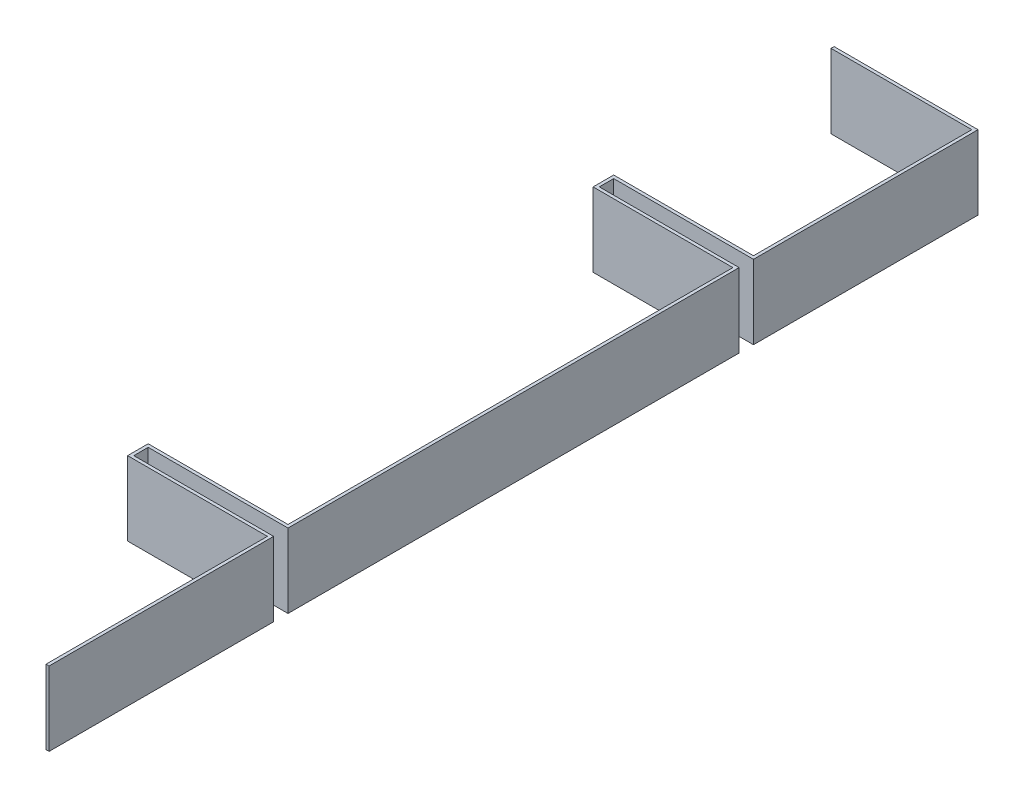
ISO-10303-21;
HEADER;
FILE_DESCRIPTION(('STEP AP214'),'2;1');
FILE_NAME('part.step','',(''),(''),'','','');
FILE_SCHEMA(('AUTOMOTIVE_DESIGN { 1 0 10303 214 1 1 1 1 }'));
ENDSEC;
DATA;
#1=APPLICATION_CONTEXT('core data for automotive mechanical design processes');
#2=APPLICATION_PROTOCOL_DEFINITION('international standard','automotive_design',2000,#1);
#3=PRODUCT_CONTEXT('',#1,'mechanical');
#4=PRODUCT('Part','Part','',(#3));
#5=PRODUCT_RELATED_PRODUCT_CATEGORY('part','',(#4));
#6=PRODUCT_DEFINITION_FORMATION('','',#4);
#7=PRODUCT_DEFINITION_CONTEXT('part definition',#1,'design');
#8=PRODUCT_DEFINITION('design','',#6,#7);
#9=PRODUCT_DEFINITION_SHAPE('','',#8);
#10=(LENGTH_UNIT() NAMED_UNIT(*) SI_UNIT(.MILLI.,.METRE.));
#11=(NAMED_UNIT(*) PLANE_ANGLE_UNIT() SI_UNIT($,.RADIAN.));
#12=(NAMED_UNIT(*) SI_UNIT($,.STERADIAN.) SOLID_ANGLE_UNIT());
#13=UNCERTAINTY_MEASURE_WITH_UNIT(LENGTH_MEASURE(1.E-05),#10,'distance_accuracy_value','');
#14=(GEOMETRIC_REPRESENTATION_CONTEXT(3) GLOBAL_UNCERTAINTY_ASSIGNED_CONTEXT((#13)) GLOBAL_UNIT_ASSIGNED_CONTEXT((#10,
#11,#12)) REPRESENTATION_CONTEXT('',''));
#15=CARTESIAN_POINT('',(0.,0.,0.));
#16=DIRECTION('',(0.,0.,1.));
#17=DIRECTION('',(1.,0.,0.));
#18=AXIS2_PLACEMENT_3D('',#15,#16,#17);
#19=CARTESIAN_POINT('',(-19.0500000000001,457.2,0.));
#20=DIRECTION('',(0.,0.,-1.));
#21=DIRECTION('',(-1.,0.,0.));
#22=AXIS2_PLACEMENT_3D('',#19,#20,#21);
#23=PLANE('',#22);
#24=DIRECTION('',(1.,0.,0.));
#25=VECTOR('',#24,1.);
#26=CARTESIAN_POINT('',(-19.0500000000001,0.,0.));
#27=LINE('',#26,#25);
#28=CARTESIAN_POINT('',(-19.0500000000001,0.,0.));
#29=VERTEX_POINT('',#28);
#30=CARTESIAN_POINT('',(0.,0.,0.));
#31=VERTEX_POINT('',#30);
#32=EDGE_CURVE('E226',#29,#31,#27,.T.);
#33=ORIENTED_EDGE('',*,*,#32,.T.);
#34=DIRECTION('',(0.,-1.,0.));
#35=VECTOR('',#34,1.);
#36=CARTESIAN_POINT('',(0.,457.2,0.));
#37=LINE('',#36,#35);
#38=CARTESIAN_POINT('',(0.,457.2,0.));
#39=VERTEX_POINT('',#38);
#40=EDGE_CURVE('E11',#39,#31,#37,.T.);
#41=ORIENTED_EDGE('',*,*,#40,.F.);
#42=DIRECTION('',(1.,0.,0.));
#43=VECTOR('',#42,1.);
#44=CARTESIAN_POINT('',(-19.0500000000001,457.2,0.));
#45=LINE('',#44,#43);
#46=CARTESIAN_POINT('',(-19.0500000000001,457.2,0.));
#47=VERTEX_POINT('',#46);
#48=EDGE_CURVE('E290',#47,#39,#45,.T.);
#49=ORIENTED_EDGE('',*,*,#48,.F.);
#50=DIRECTION('',(0.,-1.,0.));
#51=VECTOR('',#50,1.);
#52=CARTESIAN_POINT('',(-19.0500000000001,457.2,0.));
#53=LINE('',#52,#51);
#54=EDGE_CURVE('E222',#47,#29,#53,.T.);
#55=ORIENTED_EDGE('',*,*,#54,.T.);
#56=EDGE_LOOP('',(#33,#41,#49,#55));
#57=FACE_BOUND('',#56,.T.);
#58=ADVANCED_FACE('F41',(#57),#23,.F.);
#59=CARTESIAN_POINT('',(0.,457.2,0.));
#60=DIRECTION('',(-1.,0.,0.));
#61=DIRECTION('',(0.,0.,1.));
#62=AXIS2_PLACEMENT_3D('',#59,#60,#61);
#63=PLANE('',#62);
#64=DIRECTION('',(0.,0.,-1.));
#65=VECTOR('',#64,1.);
#66=CARTESIAN_POINT('',(0.,0.,0.));
#67=LINE('',#66,#65);
#68=CARTESIAN_POINT('',(0.,0.,-1386.84));
#69=VERTEX_POINT('',#68);
#70=EDGE_CURVE('E230',#31,#69,#67,.T.);
#71=ORIENTED_EDGE('',*,*,#70,.T.);
#72=DIRECTION('',(0.,-1.,0.));
#73=VECTOR('',#72,1.);
#74=CARTESIAN_POINT('',(0.,457.2,-1386.84));
#75=LINE('',#74,#73);
#76=CARTESIAN_POINT('',(0.,457.2,-1386.84));
#77=VERTEX_POINT('',#76);
#78=EDGE_CURVE('E50',#77,#69,#75,.T.);
#79=ORIENTED_EDGE('',*,*,#78,.F.);
#80=DIRECTION('',(0.,0.,-1.));
#81=VECTOR('',#80,1.);
#82=CARTESIAN_POINT('',(0.,457.2,0.));
#83=LINE('',#82,#81);
#84=EDGE_CURVE('E143',#39,#77,#83,.T.);
#85=ORIENTED_EDGE('',*,*,#84,.F.);
#86=ORIENTED_EDGE('',*,*,#40,.T.);
#87=EDGE_LOOP('',(#71,#79,#85,#86));
#88=FACE_BOUND('',#87,.T.);
#89=ADVANCED_FACE('F454',(#88),#63,.F.);
#90=CARTESIAN_POINT('',(0.,457.2,-1386.84));
#91=DIRECTION('',(0.,0.,1.));
#92=DIRECTION('',(1.,0.,0.));
#93=AXIS2_PLACEMENT_3D('',#90,#91,#92);
#94=PLANE('',#93);
#95=DIRECTION('',(-1.,0.,0.));
#96=VECTOR('',#95,1.);
#97=CARTESIAN_POINT('',(0.,0.,-1386.84));
#98=LINE('',#97,#96);
#99=CARTESIAN_POINT('',(-863.6,0.,-1386.84));
#100=VERTEX_POINT('',#99);
#101=EDGE_CURVE('E233',#69,#100,#98,.T.);
#102=ORIENTED_EDGE('',*,*,#101,.T.);
#103=DIRECTION('',(0.,-1.,0.));
#104=VECTOR('',#103,1.);
#105=CARTESIAN_POINT('',(-863.6,457.2,-1386.84));
#106=LINE('',#105,#104);
#107=CARTESIAN_POINT('',(-863.6,457.2,-1386.84));
#108=VERTEX_POINT('',#107);
#109=EDGE_CURVE('E357',#108,#100,#106,.T.);
#110=ORIENTED_EDGE('',*,*,#109,.F.);
#111=DIRECTION('',(-1.,0.,0.));
#112=VECTOR('',#111,1.);
#113=CARTESIAN_POINT('',(0.,457.2,-1386.84));
#114=LINE('',#113,#112);
#115=EDGE_CURVE('E367',#77,#108,#114,.T.);
#116=ORIENTED_EDGE('',*,*,#115,.F.);
#117=ORIENTED_EDGE('',*,*,#78,.T.);
#118=EDGE_LOOP('',(#102,#110,#116,#117));
#119=FACE_BOUND('',#118,.T.);
#120=ADVANCED_FACE('F365',(#119),#94,.F.);
#121=CARTESIAN_POINT('',(-863.6,457.2,-1386.84));
#122=DIRECTION('',(-1.,0.,0.));
#123=DIRECTION('',(0.,0.,1.));
#124=AXIS2_PLACEMENT_3D('',#121,#122,#123);
#125=PLANE('',#124);
#126=DIRECTION('',(0.,0.,-1.));
#127=VECTOR('',#126,1.);
#128=CARTESIAN_POINT('',(-863.6,0.,-1386.84));
#129=LINE('',#128,#127);
#130=CARTESIAN_POINT('',(-863.6,0.,-1475.74));
#131=VERTEX_POINT('',#130);
#132=EDGE_CURVE('E236',#100,#131,#129,.T.);
#133=ORIENTED_EDGE('',*,*,#132,.T.);
#134=DIRECTION('',(0.,-1.,0.));
#135=VECTOR('',#134,1.);
#136=CARTESIAN_POINT('',(-863.6,457.2,-1475.74));
#137=LINE('',#136,#135);
#138=CARTESIAN_POINT('',(-863.6,457.2,-1475.74));
#139=VERTEX_POINT('',#138);
#140=EDGE_CURVE('E353',#139,#131,#137,.T.);
#141=ORIENTED_EDGE('',*,*,#140,.F.);
#142=DIRECTION('',(0.,0.,-1.));
#143=VECTOR('',#142,1.);
#144=CARTESIAN_POINT('',(-863.6,457.2,-1386.84));
#145=LINE('',#144,#143);
#146=EDGE_CURVE('E386',#108,#139,#145,.T.);
#147=ORIENTED_EDGE('',*,*,#146,.F.);
#148=ORIENTED_EDGE('',*,*,#109,.T.);
#149=EDGE_LOOP('',(#133,#141,#147,#148));
#150=FACE_BOUND('',#149,.T.);
#151=ADVANCED_FACE('F376',(#150),#125,.F.);
#152=CARTESIAN_POINT('',(-863.6,457.2,-1475.74));
#153=DIRECTION('',(0.,0.,-1.));
#154=DIRECTION('',(-1.,0.,0.));
#155=AXIS2_PLACEMENT_3D('',#152,#153,#154);
#156=PLANE('',#155);
#157=DIRECTION('',(1.,0.,0.));
#158=VECTOR('',#157,1.);
#159=CARTESIAN_POINT('',(-863.6,0.,-1475.74));
#160=LINE('',#159,#158);
#161=CARTESIAN_POINT('',(0.,0.,-1475.74));
#162=VERTEX_POINT('',#161);
#163=EDGE_CURVE('E239',#131,#162,#160,.T.);
#164=ORIENTED_EDGE('',*,*,#163,.T.);
#165=DIRECTION('',(0.,-1.,0.));
#166=VECTOR('',#165,1.);
#167=CARTESIAN_POINT('',(0.,457.2,-1475.74));
#168=LINE('',#167,#166);
#169=CARTESIAN_POINT('',(0.,457.2,-1475.74));
#170=VERTEX_POINT('',#169);
#171=EDGE_CURVE('E349',#170,#162,#168,.T.);
#172=ORIENTED_EDGE('',*,*,#171,.F.);
#173=DIRECTION('',(1.,0.,0.));
#174=VECTOR('',#173,1.);
#175=CARTESIAN_POINT('',(-863.6,457.2,-1475.74));
#176=LINE('',#175,#174);
#177=EDGE_CURVE('E382',#139,#170,#176,.T.);
#178=ORIENTED_EDGE('',*,*,#177,.F.);
#179=ORIENTED_EDGE('',*,*,#140,.T.);
#180=EDGE_LOOP('',(#164,#172,#178,#179));
#181=FACE_BOUND('',#180,.T.);
#182=ADVANCED_FACE('F380',(#181),#156,.F.);
#183=CARTESIAN_POINT('',(0.,457.2,-1475.74));
#184=DIRECTION('',(-1.,0.,0.));
#185=DIRECTION('',(0.,0.,1.));
#186=AXIS2_PLACEMENT_3D('',#183,#184,#185);
#187=PLANE('',#186);
#188=DIRECTION('',(0.,0.,-1.));
#189=VECTOR('',#188,1.);
#190=CARTESIAN_POINT('',(0.,0.,-1475.74));
#191=LINE('',#190,#189);
#192=CARTESIAN_POINT('',(0.,0.,-4262.12));
#193=VERTEX_POINT('',#192);
#194=EDGE_CURVE('E242',#162,#193,#191,.T.);
#195=ORIENTED_EDGE('',*,*,#194,.T.);
#196=DIRECTION('',(0.,-1.,0.));
#197=VECTOR('',#196,1.);
#198=CARTESIAN_POINT('',(0.,457.2,-4262.12));
#199=LINE('',#198,#197);
#200=CARTESIAN_POINT('',(0.,457.2,-4262.12));
#201=VERTEX_POINT('',#200);
#202=EDGE_CURVE('E345',#201,#193,#199,.T.);
#203=ORIENTED_EDGE('',*,*,#202,.F.);
#204=DIRECTION('',(0.,0.,-1.));
#205=VECTOR('',#204,1.);
#206=CARTESIAN_POINT('',(0.,457.2,-1475.74));
#207=LINE('',#206,#205);
#208=EDGE_CURVE('E385',#170,#201,#207,.T.);
#209=ORIENTED_EDGE('',*,*,#208,.F.);
#210=ORIENTED_EDGE('',*,*,#171,.T.);
#211=EDGE_LOOP('',(#195,#203,#209,#210));
#212=FACE_BOUND('',#211,.T.);
#213=ADVANCED_FACE('F467',(#212),#187,.F.);
#214=CARTESIAN_POINT('',(0.,457.2,-4262.12));
#215=DIRECTION('',(0.,0.,1.));
#216=DIRECTION('',(1.,0.,0.));
#217=AXIS2_PLACEMENT_3D('',#214,#215,#216);
#218=PLANE('',#217);
#219=DIRECTION('',(-1.,0.,0.));
#220=VECTOR('',#219,1.);
#221=CARTESIAN_POINT('',(0.,0.,-4262.12));
#222=LINE('',#221,#220);
#223=CARTESIAN_POINT('',(-863.599999999999,0.,-4262.12));
#224=VERTEX_POINT('',#223);
#225=EDGE_CURVE('E245',#193,#224,#222,.T.);
#226=ORIENTED_EDGE('',*,*,#225,.T.);
#227=DIRECTION('',(0.,-1.,0.));
#228=VECTOR('',#227,1.);
#229=CARTESIAN_POINT('',(-863.599999999999,457.2,-4262.12));
#230=LINE('',#229,#228);
#231=CARTESIAN_POINT('',(-863.599999999999,457.2,-4262.12));
#232=VERTEX_POINT('',#231);
#233=EDGE_CURVE('E341',#232,#224,#230,.T.);
#234=ORIENTED_EDGE('',*,*,#233,.F.);
#235=DIRECTION('',(-1.,0.,0.));
#236=VECTOR('',#235,1.);
#237=CARTESIAN_POINT('',(0.,457.2,-4262.12));
#238=LINE('',#237,#236);
#239=EDGE_CURVE('E390',#201,#232,#238,.T.);
#240=ORIENTED_EDGE('',*,*,#239,.F.);
#241=ORIENTED_EDGE('',*,*,#202,.T.);
#242=EDGE_LOOP('',(#226,#234,#240,#241));
#243=FACE_BOUND('',#242,.T.);
#244=ADVANCED_FACE('F470',(#243),#218,.F.);
#245=CARTESIAN_POINT('',(-863.599999999999,457.2,-4262.12));
#246=DIRECTION('',(-1.,0.,0.));
#247=DIRECTION('',(0.,0.,1.));
#248=AXIS2_PLACEMENT_3D('',#245,#246,#247);
#249=PLANE('',#248);
#250=DIRECTION('',(0.,0.,-1.));
#251=VECTOR('',#250,1.);
#252=CARTESIAN_POINT('',(-863.599999999999,0.,-4262.12));
#253=LINE('',#252,#251);
#254=CARTESIAN_POINT('',(-863.599999999999,0.,-4351.02));
#255=VERTEX_POINT('',#254);
#256=EDGE_CURVE('E248',#224,#255,#253,.T.);
#257=ORIENTED_EDGE('',*,*,#256,.T.);
#258=DIRECTION('',(0.,-1.,0.));
#259=VECTOR('',#258,1.);
#260=CARTESIAN_POINT('',(-863.599999999999,457.2,-4351.02));
#261=LINE('',#260,#259);
#262=CARTESIAN_POINT('',(-863.599999999999,457.2,-4351.02));
#263=VERTEX_POINT('',#262);
#264=EDGE_CURVE('E337',#263,#255,#261,.T.);
#265=ORIENTED_EDGE('',*,*,#264,.F.);
#266=DIRECTION('',(0.,0.,-1.));
#267=VECTOR('',#266,1.);
#268=CARTESIAN_POINT('',(-863.599999999999,457.2,-4262.12));
#269=LINE('',#268,#267);
#270=EDGE_CURVE('E397',#232,#263,#269,.T.);
#271=ORIENTED_EDGE('',*,*,#270,.F.);
#272=ORIENTED_EDGE('',*,*,#233,.T.);
#273=EDGE_LOOP('',(#257,#265,#271,#272));
#274=FACE_BOUND('',#273,.T.);
#275=ADVANCED_FACE('F474',(#274),#249,.F.);
#276=CARTESIAN_POINT('',(-863.599999999999,457.2,-4351.02));
#277=DIRECTION('',(0.,0.,-1.));
#278=DIRECTION('',(-1.,0.,0.));
#279=AXIS2_PLACEMENT_3D('',#276,#277,#278);
#280=PLANE('',#279);
#281=DIRECTION('',(1.,0.,0.));
#282=VECTOR('',#281,1.);
#283=CARTESIAN_POINT('',(-863.599999999999,0.,-4351.02));
#284=LINE('',#283,#282);
#285=CARTESIAN_POINT('',(0.,0.,-4351.02));
#286=VERTEX_POINT('',#285);
#287=EDGE_CURVE('E251',#255,#286,#284,.T.);
#288=ORIENTED_EDGE('',*,*,#287,.T.);
#289=DIRECTION('',(0.,-1.,0.));
#290=VECTOR('',#289,1.);
#291=CARTESIAN_POINT('',(0.,457.2,-4351.02));
#292=LINE('',#291,#290);
#293=CARTESIAN_POINT('',(0.,457.2,-4351.02));
#294=VERTEX_POINT('',#293);
#295=EDGE_CURVE('E333',#294,#286,#292,.T.);
#296=ORIENTED_EDGE('',*,*,#295,.F.);
#297=DIRECTION('',(1.,0.,0.));
#298=VECTOR('',#297,1.);
#299=CARTESIAN_POINT('',(-863.599999999999,457.2,-4351.02));
#300=LINE('',#299,#298);
#301=EDGE_CURVE('E400',#263,#294,#300,.T.);
#302=ORIENTED_EDGE('',*,*,#301,.F.);
#303=ORIENTED_EDGE('',*,*,#264,.T.);
#304=EDGE_LOOP('',(#288,#296,#302,#303));
#305=FACE_BOUND('',#304,.T.);
#306=ADVANCED_FACE('F478',(#305),#280,.F.);
#307=CARTESIAN_POINT('',(0.,457.2,-4351.02));
#308=DIRECTION('',(-1.,0.,0.));
#309=DIRECTION('',(0.,0.,1.));
#310=AXIS2_PLACEMENT_3D('',#307,#308,#309);
#311=PLANE('',#310);
#312=DIRECTION('',(0.,0.,-1.));
#313=VECTOR('',#312,1.);
#314=CARTESIAN_POINT('',(0.,0.,-4351.02));
#315=LINE('',#314,#313);
#316=CARTESIAN_POINT('',(0.,0.,-5737.86));
#317=VERTEX_POINT('',#316);
#318=EDGE_CURVE('E254',#286,#317,#315,.T.);
#319=ORIENTED_EDGE('',*,*,#318,.T.);
#320=DIRECTION('',(0.,-1.,0.));
#321=VECTOR('',#320,1.);
#322=CARTESIAN_POINT('',(0.,457.2,-5737.86));
#323=LINE('',#322,#321);
#324=CARTESIAN_POINT('',(0.,457.2,-5737.86));
#325=VERTEX_POINT('',#324);
#326=EDGE_CURVE('E329',#325,#317,#323,.T.);
#327=ORIENTED_EDGE('',*,*,#326,.F.);
#328=DIRECTION('',(0.,0.,-1.));
#329=VECTOR('',#328,1.);
#330=CARTESIAN_POINT('',(0.,457.2,-4351.02));
#331=LINE('',#330,#329);
#332=EDGE_CURVE('E403',#294,#325,#331,.T.);
#333=ORIENTED_EDGE('',*,*,#332,.F.);
#334=ORIENTED_EDGE('',*,*,#295,.T.);
#335=EDGE_LOOP('',(#319,#327,#333,#334));
#336=FACE_BOUND('',#335,.T.);
#337=ADVANCED_FACE('F482',(#336),#311,.F.);
#338=CARTESIAN_POINT('',(0.,457.2,-5737.86));
#339=DIRECTION('',(0.,0.,1.));
#340=DIRECTION('',(1.,0.,0.));
#341=AXIS2_PLACEMENT_3D('',#338,#339,#340);
#342=PLANE('',#341);
#343=DIRECTION('',(-1.,0.,0.));
#344=VECTOR('',#343,1.);
#345=CARTESIAN_POINT('',(0.,0.,-5737.86));
#346=LINE('',#345,#344);
#347=CARTESIAN_POINT('',(-889.,0.,-5737.86));
#348=VERTEX_POINT('',#347);
#349=EDGE_CURVE('E257',#317,#348,#346,.T.);
#350=ORIENTED_EDGE('',*,*,#349,.T.);
#351=DIRECTION('',(0.,-1.,0.));
#352=VECTOR('',#351,1.);
#353=CARTESIAN_POINT('',(-889.,457.2,-5737.86));
#354=LINE('',#353,#352);
#355=CARTESIAN_POINT('',(-889.,457.2,-5737.86));
#356=VERTEX_POINT('',#355);
#357=EDGE_CURVE('E325',#356,#348,#354,.T.);
#358=ORIENTED_EDGE('',*,*,#357,.F.);
#359=DIRECTION('',(-1.,0.,0.));
#360=VECTOR('',#359,1.);
#361=CARTESIAN_POINT('',(0.,457.2,-5737.86));
#362=LINE('',#361,#360);
#363=EDGE_CURVE('E406',#325,#356,#362,.T.);
#364=ORIENTED_EDGE('',*,*,#363,.F.);
#365=ORIENTED_EDGE('',*,*,#326,.T.);
#366=EDGE_LOOP('',(#350,#358,#364,#365));
#367=FACE_BOUND('',#366,.T.);
#368=ADVANCED_FACE('F486',(#367),#342,.F.);
#369=CARTESIAN_POINT('',(-889.,457.2,-5737.86));
#370=DIRECTION('',(1.,0.,0.));
#371=DIRECTION('',(0.,0.,-1.));
#372=AXIS2_PLACEMENT_3D('',#369,#370,#371);
#373=PLANE('',#372);
#374=DIRECTION('',(0.,0.,1.));
#375=VECTOR('',#374,1.);
#376=CARTESIAN_POINT('',(-889.,0.,-5737.86));
#377=LINE('',#376,#375);
#378=CARTESIAN_POINT('',(-889.,0.,-5718.81));
#379=VERTEX_POINT('',#378);
#380=EDGE_CURVE('E260',#348,#379,#377,.T.);
#381=ORIENTED_EDGE('',*,*,#380,.T.);
#382=DIRECTION('',(0.,-1.,0.));
#383=VECTOR('',#382,1.);
#384=CARTESIAN_POINT('',(-889.,457.2,-5718.81));
#385=LINE('',#384,#383);
#386=CARTESIAN_POINT('',(-889.,457.2,-5718.81));
#387=VERTEX_POINT('',#386);
#388=EDGE_CURVE('E321',#387,#379,#385,.T.);
#389=ORIENTED_EDGE('',*,*,#388,.F.);
#390=DIRECTION('',(0.,0.,1.));
#391=VECTOR('',#390,1.);
#392=CARTESIAN_POINT('',(-889.,457.2,-5737.86));
#393=LINE('',#392,#391);
#394=EDGE_CURVE('E409',#356,#387,#393,.T.);
#395=ORIENTED_EDGE('',*,*,#394,.F.);
#396=ORIENTED_EDGE('',*,*,#357,.T.);
#397=EDGE_LOOP('',(#381,#389,#395,#396));
#398=FACE_BOUND('',#397,.T.);
#399=ADVANCED_FACE('F490',(#398),#373,.F.);
#400=CARTESIAN_POINT('',(-889.,457.2,-5718.81));
#401=DIRECTION('',(0.,0.,-1.));
#402=DIRECTION('',(-1.,0.,0.));
#403=AXIS2_PLACEMENT_3D('',#400,#401,#402);
#404=PLANE('',#403);
#405=DIRECTION('',(1.,0.,0.));
#406=VECTOR('',#405,1.);
#407=CARTESIAN_POINT('',(-889.,0.,-5718.81));
#408=LINE('',#407,#406);
#409=CARTESIAN_POINT('',(-19.0500000000002,0.,-5718.81));
#410=VERTEX_POINT('',#409);
#411=EDGE_CURVE('E263',#379,#410,#408,.T.);
#412=ORIENTED_EDGE('',*,*,#411,.T.);
#413=DIRECTION('',(0.,-1.,0.));
#414=VECTOR('',#413,1.);
#415=CARTESIAN_POINT('',(-19.0500000000002,457.2,-5718.81));
#416=LINE('',#415,#414);
#417=CARTESIAN_POINT('',(-19.0500000000002,457.2,-5718.81));
#418=VERTEX_POINT('',#417);
#419=EDGE_CURVE('E317',#418,#410,#416,.T.);
#420=ORIENTED_EDGE('',*,*,#419,.F.);
#421=DIRECTION('',(1.,0.,0.));
#422=VECTOR('',#421,1.);
#423=CARTESIAN_POINT('',(-889.,457.2,-5718.81));
#424=LINE('',#423,#422);
#425=EDGE_CURVE('E412',#387,#418,#424,.T.);
#426=ORIENTED_EDGE('',*,*,#425,.F.);
#427=ORIENTED_EDGE('',*,*,#388,.T.);
#428=EDGE_LOOP('',(#412,#420,#426,#427));
#429=FACE_BOUND('',#428,.T.);
#430=ADVANCED_FACE('F494',(#429),#404,.F.);
#431=CARTESIAN_POINT('',(-19.0500000000002,457.2,-5718.81));
#432=DIRECTION('',(1.,0.,0.));
#433=DIRECTION('',(0.,0.,-1.));
#434=AXIS2_PLACEMENT_3D('',#431,#432,#433);
#435=PLANE('',#434);
#436=DIRECTION('',(0.,0.,1.));
#437=VECTOR('',#436,1.);
#438=CARTESIAN_POINT('',(-19.0500000000002,0.,-5718.81));
#439=LINE('',#438,#437);
#440=CARTESIAN_POINT('',(-19.0500000000001,0.,-4370.07));
#441=VERTEX_POINT('',#440);
#442=EDGE_CURVE('E266',#410,#441,#439,.T.);
#443=ORIENTED_EDGE('',*,*,#442,.T.);
#444=DIRECTION('',(0.,-1.,0.));
#445=VECTOR('',#444,1.);
#446=CARTESIAN_POINT('',(-19.0500000000001,457.2,-4370.07));
#447=LINE('',#446,#445);
#448=CARTESIAN_POINT('',(-19.0500000000001,457.2,-4370.07));
#449=VERTEX_POINT('',#448);
#450=EDGE_CURVE('E313',#449,#441,#447,.T.);
#451=ORIENTED_EDGE('',*,*,#450,.F.);
#452=DIRECTION('',(0.,0.,1.));
#453=VECTOR('',#452,1.);
#454=CARTESIAN_POINT('',(-19.0500000000002,457.2,-5718.81));
#455=LINE('',#454,#453);
#456=EDGE_CURVE('E415',#418,#449,#455,.T.);
#457=ORIENTED_EDGE('',*,*,#456,.F.);
#458=ORIENTED_EDGE('',*,*,#419,.T.);
#459=EDGE_LOOP('',(#443,#451,#457,#458));
#460=FACE_BOUND('',#459,.T.);
#461=ADVANCED_FACE('F498',(#460),#435,.F.);
#462=CARTESIAN_POINT('',(-19.0500000000001,457.2,-4370.07));
#463=DIRECTION('',(0.,0.,1.));
#464=DIRECTION('',(1.,0.,0.));
#465=AXIS2_PLACEMENT_3D('',#462,#463,#464);
#466=PLANE('',#465);
#467=DIRECTION('',(-1.,0.,0.));
#468=VECTOR('',#467,1.);
#469=CARTESIAN_POINT('',(-19.0500000000001,0.,-4370.07));
#470=LINE('',#469,#468);
#471=CARTESIAN_POINT('',(-882.649999999999,0.,-4370.07));
#472=VERTEX_POINT('',#471);
#473=EDGE_CURVE('E269',#441,#472,#470,.T.);
#474=ORIENTED_EDGE('',*,*,#473,.T.);
#475=DIRECTION('',(0.,-1.,0.));
#476=VECTOR('',#475,1.);
#477=CARTESIAN_POINT('',(-882.649999999999,457.2,-4370.07));
#478=LINE('',#477,#476);
#479=CARTESIAN_POINT('',(-882.649999999999,457.2,-4370.07));
#480=VERTEX_POINT('',#479);
#481=EDGE_CURVE('E309',#480,#472,#478,.T.);
#482=ORIENTED_EDGE('',*,*,#481,.F.);
#483=DIRECTION('',(-1.,0.,0.));
#484=VECTOR('',#483,1.);
#485=CARTESIAN_POINT('',(-19.0500000000001,457.2,-4370.07));
#486=LINE('',#485,#484);
#487=EDGE_CURVE('E418',#449,#480,#486,.T.);
#488=ORIENTED_EDGE('',*,*,#487,.F.);
#489=ORIENTED_EDGE('',*,*,#450,.T.);
#490=EDGE_LOOP('',(#474,#482,#488,#489));
#491=FACE_BOUND('',#490,.T.);
#492=ADVANCED_FACE('F502',(#491),#466,.F.);
#493=CARTESIAN_POINT('',(-882.649999999999,457.2,-4370.07));
#494=DIRECTION('',(1.,0.,0.));
#495=DIRECTION('',(0.,0.,-1.));
#496=AXIS2_PLACEMENT_3D('',#493,#494,#495);
#497=PLANE('',#496);
#498=DIRECTION('',(0.,0.,1.));
#499=VECTOR('',#498,1.);
#500=CARTESIAN_POINT('',(-882.649999999999,0.,-4370.07));
#501=LINE('',#500,#499);
#502=CARTESIAN_POINT('',(-882.649999999999,0.,-4243.07));
#503=VERTEX_POINT('',#502);
#504=EDGE_CURVE('E272',#472,#503,#501,.T.);
#505=ORIENTED_EDGE('',*,*,#504,.T.);
#506=DIRECTION('',(0.,-1.,0.));
#507=VECTOR('',#506,1.);
#508=CARTESIAN_POINT('',(-882.649999999999,457.2,-4243.07));
#509=LINE('',#508,#507);
#510=CARTESIAN_POINT('',(-882.649999999999,457.2,-4243.07));
#511=VERTEX_POINT('',#510);
#512=EDGE_CURVE('E305',#511,#503,#509,.T.);
#513=ORIENTED_EDGE('',*,*,#512,.F.);
#514=DIRECTION('',(0.,0.,1.));
#515=VECTOR('',#514,1.);
#516=CARTESIAN_POINT('',(-882.649999999999,457.2,-4370.07));
#517=LINE('',#516,#515);
#518=EDGE_CURVE('E421',#480,#511,#517,.T.);
#519=ORIENTED_EDGE('',*,*,#518,.F.);
#520=ORIENTED_EDGE('',*,*,#481,.T.);
#521=EDGE_LOOP('',(#505,#513,#519,#520));
#522=FACE_BOUND('',#521,.T.);
#523=ADVANCED_FACE('F506',(#522),#497,.F.);
#524=CARTESIAN_POINT('',(-882.649999999999,457.2,-4243.07));
#525=DIRECTION('',(0.,0.,-1.));
#526=DIRECTION('',(-1.,0.,0.));
#527=AXIS2_PLACEMENT_3D('',#524,#525,#526);
#528=PLANE('',#527);
#529=DIRECTION('',(1.,0.,0.));
#530=VECTOR('',#529,1.);
#531=CARTESIAN_POINT('',(-882.649999999999,0.,-4243.07));
#532=LINE('',#531,#530);
#533=CARTESIAN_POINT('',(-19.0500000000001,0.,-4243.07));
#534=VERTEX_POINT('',#533);
#535=EDGE_CURVE('E275',#503,#534,#532,.T.);
#536=ORIENTED_EDGE('',*,*,#535,.T.);
#537=DIRECTION('',(0.,-1.,0.));
#538=VECTOR('',#537,1.);
#539=CARTESIAN_POINT('',(-19.0500000000001,457.2,-4243.07));
#540=LINE('',#539,#538);
#541=CARTESIAN_POINT('',(-19.0500000000001,457.2,-4243.07));
#542=VERTEX_POINT('',#541);
#543=EDGE_CURVE('E301',#542,#534,#540,.T.);
#544=ORIENTED_EDGE('',*,*,#543,.F.);
#545=DIRECTION('',(1.,0.,0.));
#546=VECTOR('',#545,1.);
#547=CARTESIAN_POINT('',(-882.649999999999,457.2,-4243.07));
#548=LINE('',#547,#546);
#549=EDGE_CURVE('E424',#511,#542,#548,.T.);
#550=ORIENTED_EDGE('',*,*,#549,.F.);
#551=ORIENTED_EDGE('',*,*,#512,.T.);
#552=EDGE_LOOP('',(#536,#544,#550,#551));
#553=FACE_BOUND('',#552,.T.);
#554=ADVANCED_FACE('F510',(#553),#528,.F.);
#555=CARTESIAN_POINT('',(-19.0500000000001,457.2,-4243.07));
#556=DIRECTION('',(1.,0.,0.));
#557=DIRECTION('',(0.,0.,-1.));
#558=AXIS2_PLACEMENT_3D('',#555,#556,#557);
#559=PLANE('',#558);
#560=DIRECTION('',(0.,0.,1.));
#561=VECTOR('',#560,1.);
#562=CARTESIAN_POINT('',(-19.0500000000001,0.,-4243.07));
#563=LINE('',#562,#561);
#564=CARTESIAN_POINT('',(-19.0500000000002,0.,-1494.79));
#565=VERTEX_POINT('',#564);
#566=EDGE_CURVE('E278',#534,#565,#563,.T.);
#567=ORIENTED_EDGE('',*,*,#566,.T.);
#568=DIRECTION('',(0.,-1.,0.));
#569=VECTOR('',#568,1.);
#570=CARTESIAN_POINT('',(-19.0500000000002,457.2,-1494.79));
#571=LINE('',#570,#569);
#572=CARTESIAN_POINT('',(-19.0500000000002,457.2,-1494.79));
#573=VERTEX_POINT('',#572);
#574=EDGE_CURVE('E297',#573,#565,#571,.T.);
#575=ORIENTED_EDGE('',*,*,#574,.F.);
#576=DIRECTION('',(0.,0.,1.));
#577=VECTOR('',#576,1.);
#578=CARTESIAN_POINT('',(-19.0500000000001,457.2,-4243.07));
#579=LINE('',#578,#577);
#580=EDGE_CURVE('E427',#542,#573,#579,.T.);
#581=ORIENTED_EDGE('',*,*,#580,.F.);
#582=ORIENTED_EDGE('',*,*,#543,.T.);
#583=EDGE_LOOP('',(#567,#575,#581,#582));
#584=FACE_BOUND('',#583,.T.);
#585=ADVANCED_FACE('F435',(#584),#559,.F.);
#586=CARTESIAN_POINT('',(-19.0500000000002,457.2,-1494.79));
#587=DIRECTION('',(0.,0.,1.));
#588=DIRECTION('',(1.,0.,0.));
#589=AXIS2_PLACEMENT_3D('',#586,#587,#588);
#590=PLANE('',#589);
#591=DIRECTION('',(-1.,0.,0.));
#592=VECTOR('',#591,1.);
#593=CARTESIAN_POINT('',(-19.0500000000002,0.,-1494.79));
#594=LINE('',#593,#592);
#595=CARTESIAN_POINT('',(-882.65,0.,-1494.79));
#596=VERTEX_POINT('',#595);
#597=EDGE_CURVE('E281',#565,#596,#594,.T.);
#598=ORIENTED_EDGE('',*,*,#597,.T.);
#599=DIRECTION('',(0.,-1.,0.));
#600=VECTOR('',#599,1.);
#601=CARTESIAN_POINT('',(-882.65,457.2,-1494.79));
#602=LINE('',#601,#600);
#603=CARTESIAN_POINT('',(-882.65,457.2,-1494.79));
#604=VERTEX_POINT('',#603);
#605=EDGE_CURVE('E215',#604,#596,#602,.T.);
#606=ORIENTED_EDGE('',*,*,#605,.F.);
#607=DIRECTION('',(-1.,0.,0.));
#608=VECTOR('',#607,1.);
#609=CARTESIAN_POINT('',(-19.0500000000002,457.2,-1494.79));
#610=LINE('',#609,#608);
#611=EDGE_CURVE('E204',#573,#604,#610,.T.);
#612=ORIENTED_EDGE('',*,*,#611,.F.);
#613=ORIENTED_EDGE('',*,*,#574,.T.);
#614=EDGE_LOOP('',(#598,#606,#612,#613));
#615=FACE_BOUND('',#614,.T.);
#616=ADVANCED_FACE('F439',(#615),#590,.F.);
#617=CARTESIAN_POINT('',(-882.65,457.2,-1494.79));
#618=DIRECTION('',(1.,0.,0.));
#619=DIRECTION('',(0.,0.,-1.));
#620=AXIS2_PLACEMENT_3D('',#617,#618,#619);
#621=PLANE('',#620);
#622=DIRECTION('',(0.,0.,1.));
#623=VECTOR('',#622,1.);
#624=CARTESIAN_POINT('',(-882.65,0.,-1494.79));
#625=LINE('',#624,#623);
#626=CARTESIAN_POINT('',(-882.65,0.,-1367.79));
#627=VERTEX_POINT('',#626);
#628=EDGE_CURVE('E213',#596,#627,#625,.T.);
#629=ORIENTED_EDGE('',*,*,#628,.T.);
#630=DIRECTION('',(0.,-1.,0.));
#631=VECTOR('',#630,1.);
#632=CARTESIAN_POINT('',(-882.65,457.2,-1367.79));
#633=LINE('',#632,#631);
#634=CARTESIAN_POINT('',(-882.65,457.2,-1367.79));
#635=VERTEX_POINT('',#634);
#636=EDGE_CURVE('E210',#635,#627,#633,.T.);
#637=ORIENTED_EDGE('',*,*,#636,.F.);
#638=DIRECTION('',(0.,0.,1.));
#639=VECTOR('',#638,1.);
#640=CARTESIAN_POINT('',(-882.65,457.2,-1494.79));
#641=LINE('',#640,#639);
#642=EDGE_CURVE('E198',#604,#635,#641,.T.);
#643=ORIENTED_EDGE('',*,*,#642,.F.);
#644=ORIENTED_EDGE('',*,*,#605,.T.);
#645=EDGE_LOOP('',(#629,#637,#643,#644));
#646=FACE_BOUND('',#645,.T.);
#647=ADVANCED_FACE('F211',(#646),#621,.F.);
#648=CARTESIAN_POINT('',(-882.65,457.2,-1367.79));
#649=DIRECTION('',(0.,0.,-1.));
#650=DIRECTION('',(-1.,0.,0.));
#651=AXIS2_PLACEMENT_3D('',#648,#649,#650);
#652=PLANE('',#651);
#653=DIRECTION('',(1.,0.,0.));
#654=VECTOR('',#653,1.);
#655=CARTESIAN_POINT('',(-882.65,0.,-1367.79));
#656=LINE('',#655,#654);
#657=CARTESIAN_POINT('',(-19.0500000000002,0.,-1367.79));
#658=VERTEX_POINT('',#657);
#659=EDGE_CURVE('E129',#627,#658,#656,.T.);
#660=ORIENTED_EDGE('',*,*,#659,.T.);
#661=DIRECTION('',(0.,-1.,0.));
#662=VECTOR('',#661,1.);
#663=CARTESIAN_POINT('',(-19.0500000000002,457.2,-1367.79));
#664=LINE('',#663,#662);
#665=CARTESIAN_POINT('',(-19.0500000000002,457.2,-1367.79));
#666=VERTEX_POINT('',#665);
#667=EDGE_CURVE('E216',#666,#658,#664,.T.);
#668=ORIENTED_EDGE('',*,*,#667,.F.);
#669=DIRECTION('',(1.,0.,0.));
#670=VECTOR('',#669,1.);
#671=CARTESIAN_POINT('',(-882.65,457.2,-1367.79));
#672=LINE('',#671,#670);
#673=EDGE_CURVE('E202',#635,#666,#672,.T.);
#674=ORIENTED_EDGE('',*,*,#673,.F.);
#675=ORIENTED_EDGE('',*,*,#636,.T.);
#676=EDGE_LOOP('',(#660,#668,#674,#675));
#677=FACE_BOUND('',#676,.T.);
#678=ADVANCED_FACE('F218',(#677),#652,.F.);
#679=CARTESIAN_POINT('',(-19.0500000000002,457.2,-1367.79));
#680=DIRECTION('',(1.,0.,0.));
#681=DIRECTION('',(0.,0.,-1.));
#682=AXIS2_PLACEMENT_3D('',#679,#680,#681);
#683=PLANE('',#682);
#684=DIRECTION('',(0.,0.,1.));
#685=VECTOR('',#684,1.);
#686=CARTESIAN_POINT('',(-19.0500000000002,0.,-1367.79));
#687=LINE('',#686,#685);
#688=EDGE_CURVE('E135',#658,#29,#687,.T.);
#689=ORIENTED_EDGE('',*,*,#688,.T.);
#690=ORIENTED_EDGE('',*,*,#54,.F.);
#691=DIRECTION('',(0.,0.,1.));
#692=VECTOR('',#691,1.);
#693=CARTESIAN_POINT('',(-19.0500000000002,457.2,-1367.79));
#694=LINE('',#693,#692);
#695=EDGE_CURVE('E58',#666,#47,#694,.T.);
#696=ORIENTED_EDGE('',*,*,#695,.F.);
#697=ORIENTED_EDGE('',*,*,#667,.T.);
#698=EDGE_LOOP('',(#689,#690,#696,#697));
#699=FACE_BOUND('',#698,.T.);
#700=ADVANCED_FACE('F443',(#699),#683,.F.);
#701=CARTESIAN_POINT('',(0.,457.2,0.));
#702=DIRECTION('',(0.,1.,0.));
#703=DIRECTION('',(0.,0.,1.));
#704=AXIS2_PLACEMENT_3D('',#701,#702,#703);
#705=PLANE('',#704);
#706=ORIENTED_EDGE('',*,*,#48,.T.);
#707=ORIENTED_EDGE('',*,*,#84,.T.);
#708=ORIENTED_EDGE('',*,*,#115,.T.);
#709=ORIENTED_EDGE('',*,*,#146,.T.);
#710=ORIENTED_EDGE('',*,*,#177,.T.);
#711=ORIENTED_EDGE('',*,*,#208,.T.);
#712=ORIENTED_EDGE('',*,*,#239,.T.);
#713=ORIENTED_EDGE('',*,*,#270,.T.);
#714=ORIENTED_EDGE('',*,*,#301,.T.);
#715=ORIENTED_EDGE('',*,*,#332,.T.);
#716=ORIENTED_EDGE('',*,*,#363,.T.);
#717=ORIENTED_EDGE('',*,*,#394,.T.);
#718=ORIENTED_EDGE('',*,*,#425,.T.);
#719=ORIENTED_EDGE('',*,*,#456,.T.);
#720=ORIENTED_EDGE('',*,*,#487,.T.);
#721=ORIENTED_EDGE('',*,*,#518,.T.);
#722=ORIENTED_EDGE('',*,*,#549,.T.);
#723=ORIENTED_EDGE('',*,*,#580,.T.);
#724=ORIENTED_EDGE('',*,*,#611,.T.);
#725=ORIENTED_EDGE('',*,*,#642,.T.);
#726=ORIENTED_EDGE('',*,*,#673,.T.);
#727=ORIENTED_EDGE('',*,*,#695,.T.);
#728=EDGE_LOOP('',(#706,#707,#708,#709,#710,#711,#712,#713,#714,#715,#716,#717,#718,#719,#720,
#721,#722,#723,#724,#725,#726,#727));
#729=FACE_BOUND('',#728,.T.);
#730=ADVANCED_FACE('F200',(#729),#705,.T.);
#731=CARTESIAN_POINT('',(0.,0.,0.));
#732=DIRECTION('',(0.,1.,0.));
#733=DIRECTION('',(0.,0.,1.));
#734=AXIS2_PLACEMENT_3D('',#731,#732,#733);
#735=PLANE('',#734);
#736=ORIENTED_EDGE('',*,*,#32,.F.);
#737=ORIENTED_EDGE('',*,*,#688,.F.);
#738=ORIENTED_EDGE('',*,*,#659,.F.);
#739=ORIENTED_EDGE('',*,*,#628,.F.);
#740=ORIENTED_EDGE('',*,*,#597,.F.);
#741=ORIENTED_EDGE('',*,*,#566,.F.);
#742=ORIENTED_EDGE('',*,*,#535,.F.);
#743=ORIENTED_EDGE('',*,*,#504,.F.);
#744=ORIENTED_EDGE('',*,*,#473,.F.);
#745=ORIENTED_EDGE('',*,*,#442,.F.);
#746=ORIENTED_EDGE('',*,*,#411,.F.);
#747=ORIENTED_EDGE('',*,*,#380,.F.);
#748=ORIENTED_EDGE('',*,*,#349,.F.);
#749=ORIENTED_EDGE('',*,*,#318,.F.);
#750=ORIENTED_EDGE('',*,*,#287,.F.);
#751=ORIENTED_EDGE('',*,*,#256,.F.);
#752=ORIENTED_EDGE('',*,*,#225,.F.);
#753=ORIENTED_EDGE('',*,*,#194,.F.);
#754=ORIENTED_EDGE('',*,*,#163,.F.);
#755=ORIENTED_EDGE('',*,*,#132,.F.);
#756=ORIENTED_EDGE('',*,*,#101,.F.);
#757=ORIENTED_EDGE('',*,*,#70,.F.);
#758=EDGE_LOOP('',(#736,#737,#738,#739,#740,#741,#742,#743,#744,#745,#746,#747,#748,#749,#750,
#751,#752,#753,#754,#755,#756,#757));
#759=FACE_BOUND('',#758,.T.);
#760=ADVANCED_FACE('F371',(#759),#735,.F.);
#761=CLOSED_SHELL('',(#58,#89,#120,#151,#182,#213,#244,#275,#306,#337,#368,#399,#430,#461,#492,
#523,#554,#585,#616,#647,#678,#700,#730,#760));
#762=MANIFOLD_SOLID_BREP('B2',#761);
#763=ADVANCED_BREP_SHAPE_REPRESENTATION('',(#18,#762),#14);
#764=SHAPE_DEFINITION_REPRESENTATION(#9,#763);
ENDSEC;
END-ISO-10303-21;
